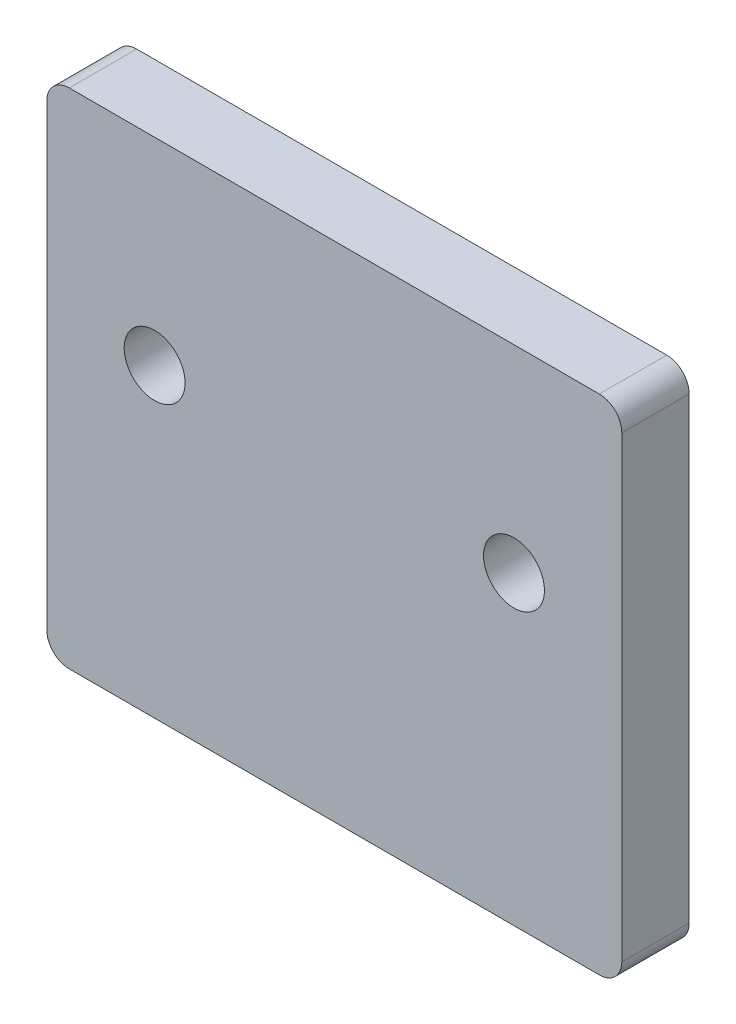
ISO-10303-21;
HEADER;
FILE_DESCRIPTION(('STEP AP214'),'2;1');
FILE_NAME('part.step','',(''),(''),'','','');
FILE_SCHEMA(('AUTOMOTIVE_DESIGN { 1 0 10303 214 1 1 1 1 }'));
ENDSEC;
DATA;
#1=APPLICATION_CONTEXT('core data for automotive mechanical design processes');
#2=APPLICATION_PROTOCOL_DEFINITION('international standard','automotive_design',2000,#1);
#3=PRODUCT_CONTEXT('',#1,'mechanical');
#4=PRODUCT('Part','Part','',(#3));
#5=PRODUCT_RELATED_PRODUCT_CATEGORY('part','',(#4));
#6=PRODUCT_DEFINITION_FORMATION('','',#4);
#7=PRODUCT_DEFINITION_CONTEXT('part definition',#1,'design');
#8=PRODUCT_DEFINITION('design','',#6,#7);
#9=PRODUCT_DEFINITION_SHAPE('','',#8);
#10=(LENGTH_UNIT() NAMED_UNIT(*) SI_UNIT(.MILLI.,.METRE.));
#11=(NAMED_UNIT(*) PLANE_ANGLE_UNIT() SI_UNIT($,.RADIAN.));
#12=(NAMED_UNIT(*) SI_UNIT($,.STERADIAN.) SOLID_ANGLE_UNIT());
#13=UNCERTAINTY_MEASURE_WITH_UNIT(LENGTH_MEASURE(1.E-05),#10,'distance_accuracy_value','');
#14=(GEOMETRIC_REPRESENTATION_CONTEXT(3) GLOBAL_UNCERTAINTY_ASSIGNED_CONTEXT((#13)) GLOBAL_UNIT_ASSIGNED_CONTEXT((#10,
#11,#12)) REPRESENTATION_CONTEXT('',''));
#15=CARTESIAN_POINT('',(0.,0.,0.));
#16=DIRECTION('',(0.,0.,1.));
#17=DIRECTION('',(1.,0.,0.));
#18=AXIS2_PLACEMENT_3D('',#15,#16,#17);
#19=CARTESIAN_POINT('',(-1.58750000000011,1.58749999999956,4.7625));
#20=DIRECTION('',(0.,0.,1.));
#21=DIRECTION('',(1.,0.,0.));
#22=AXIS2_PLACEMENT_3D('',#19,#20,#21);
#23=PLANE('',#22);
#24=CARTESIAN_POINT('',(-7.62000000000011,21.5899999999996,4.7625));
#25=DIRECTION('',(0.,0.,1.));
#26=DIRECTION('',(1.,0.,0.));
#27=AXIS2_PLACEMENT_3D('',#24,#25,#26);
#28=CIRCLE('',#27,2.15265);
#29=CARTESIAN_POINT('',(-9.77265000000011,21.5899999999996,4.7625));
#30=VERTEX_POINT('',#29);
#31=EDGE_CURVE('E134',#30,#30,#28,.T.);
#32=ORIENTED_EDGE('',*,*,#31,.F.);
#33=EDGE_LOOP('',(#32));
#34=FACE_BOUND('',#33,.T.);
#35=CARTESIAN_POINT('',(-1.58750000000011,1.58749999999956,4.7625));
#36=DIRECTION('',(0.,0.,1.));
#37=DIRECTION('',(1.,0.,0.));
#38=AXIS2_PLACEMENT_3D('',#35,#36,#37);
#39=CIRCLE('',#38,1.5875);
#40=CARTESIAN_POINT('',(-1.58750000000011,-4.43872369415566E-13,4.7625));
#41=VERTEX_POINT('',#40);
#42=CARTESIAN_POINT('',(-1.10588621593521E-13,1.58749999999956,4.7625));
#43=VERTEX_POINT('',#42);
#44=EDGE_CURVE('E145',#41,#43,#39,.T.);
#45=ORIENTED_EDGE('',*,*,#44,.T.);
#46=DIRECTION('',(0.,1.,0.));
#47=VECTOR('',#46,1.);
#48=CARTESIAN_POINT('',(-1.10588621593521E-13,1.58749999999956,4.7625));
#49=LINE('',#48,#47);
#50=CARTESIAN_POINT('',(-1.15142270717961E-13,33.9724999999996,4.7625));
#51=VERTEX_POINT('',#50);
#52=EDGE_CURVE('E93',#43,#51,#49,.T.);
#53=ORIENTED_EDGE('',*,*,#52,.T.);
#54=CARTESIAN_POINT('',(-1.58750000000011,33.9724999999996,4.7625));
#55=DIRECTION('',(0.,0.,1.));
#56=DIRECTION('',(1.,0.,0.));
#57=AXIS2_PLACEMENT_3D('',#54,#55,#56);
#58=CIRCLE('',#57,1.5875);
#59=CARTESIAN_POINT('',(-1.58750000000011,35.5599999999996,4.7625));
#60=VERTEX_POINT('',#59);
#61=EDGE_CURVE('E160',#51,#60,#58,.T.);
#62=ORIENTED_EDGE('',*,*,#61,.T.);
#63=DIRECTION('',(-1.,0.,0.));
#64=VECTOR('',#63,1.);
#65=CARTESIAN_POINT('',(-1.58750000000011,35.5599999999996,4.7625));
#66=LINE('',#65,#64);
#67=CARTESIAN_POINT('',(-39.0525000000001,35.5599999999995,4.7625));
#68=VERTEX_POINT('',#67);
#69=EDGE_CURVE('E173',#60,#68,#66,.T.);
#70=ORIENTED_EDGE('',*,*,#69,.T.);
#71=CARTESIAN_POINT('',(-39.0525000000001,33.9724999999995,4.7625));
#72=DIRECTION('',(0.,0.,1.));
#73=DIRECTION('',(1.,0.,0.));
#74=AXIS2_PLACEMENT_3D('',#71,#72,#73);
#75=CIRCLE('',#74,1.5875);
#76=CARTESIAN_POINT('',(-40.6400000000001,33.9724999999995,4.7625));
#77=VERTEX_POINT('',#76);
#78=EDGE_CURVE('E112',#68,#77,#75,.T.);
#79=ORIENTED_EDGE('',*,*,#78,.T.);
#80=DIRECTION('',(0.,-1.,0.));
#81=VECTOR('',#80,1.);
#82=CARTESIAN_POINT('',(-40.6400000000001,33.9724999999995,4.7625));
#83=LINE('',#82,#81);
#84=CARTESIAN_POINT('',(-40.6400000000001,1.58749999999955,4.7625));
#85=VERTEX_POINT('',#84);
#86=EDGE_CURVE('E106',#77,#85,#83,.T.);
#87=ORIENTED_EDGE('',*,*,#86,.T.);
#88=CARTESIAN_POINT('',(-39.0525000000001,1.58749999999955,4.7625));
#89=DIRECTION('',(0.,0.,1.));
#90=DIRECTION('',(1.,0.,0.));
#91=AXIS2_PLACEMENT_3D('',#88,#89,#90);
#92=CIRCLE('',#91,1.5875);
#93=CARTESIAN_POINT('',(-39.0525000000001,-4.47558656802016E-13,4.7625));
#94=VERTEX_POINT('',#93);
#95=EDGE_CURVE('E110',#85,#94,#92,.T.);
#96=ORIENTED_EDGE('',*,*,#95,.T.);
#97=DIRECTION('',(1.,0.,0.));
#98=VECTOR('',#97,1.);
#99=CARTESIAN_POINT('',(-39.0525000000001,-4.47558656802016E-13,4.7625));
#100=LINE('',#99,#98);
#101=EDGE_CURVE('E50',#94,#41,#100,.T.);
#102=ORIENTED_EDGE('',*,*,#101,.T.);
#103=EDGE_LOOP('',(#45,#53,#62,#70,#79,#87,#96,#102));
#104=FACE_BOUND('',#103,.T.);
#105=CARTESIAN_POINT('',(-33.0200000000001,21.5899999999996,4.7625));
#106=DIRECTION('',(0.,0.,1.));
#107=DIRECTION('',(1.,0.,0.));
#108=AXIS2_PLACEMENT_3D('',#105,#106,#107);
#109=CIRCLE('',#108,2.15265);
#110=CARTESIAN_POINT('',(-35.1726500000001,21.5899999999996,4.7625));
#111=VERTEX_POINT('',#110);
#112=EDGE_CURVE('E182',#111,#111,#109,.T.);
#113=ORIENTED_EDGE('',*,*,#112,.F.);
#114=EDGE_LOOP('',(#113));
#115=FACE_BOUND('',#114,.T.);
#116=ADVANCED_FACE('F33',(#34,#104,#115),#23,.T.);
#117=CARTESIAN_POINT('',(-1.58750000000011,1.58749999999956,0.));
#118=DIRECTION('',(0.,0.,1.));
#119=DIRECTION('',(1.,0.,0.));
#120=AXIS2_PLACEMENT_3D('',#117,#118,#119);
#121=PLANE('',#120);
#122=CARTESIAN_POINT('',(-1.58750000000011,1.58749999999956,0.));
#123=DIRECTION('',(0.,0.,1.));
#124=DIRECTION('',(1.,0.,0.));
#125=AXIS2_PLACEMENT_3D('',#122,#123,#124);
#126=CIRCLE('',#125,1.5875);
#127=CARTESIAN_POINT('',(-1.58750000000011,-4.43872369415566E-13,0.));
#128=VERTEX_POINT('',#127);
#129=CARTESIAN_POINT('',(-1.10588621593521E-13,1.58749999999956,0.));
#130=VERTEX_POINT('',#129);
#131=EDGE_CURVE('E130',#128,#130,#126,.T.);
#132=ORIENTED_EDGE('',*,*,#131,.F.);
#133=DIRECTION('',(1.,0.,0.));
#134=VECTOR('',#133,1.);
#135=CARTESIAN_POINT('',(-39.0525000000001,-4.47558656802016E-13,0.));
#136=LINE('',#135,#134);
#137=CARTESIAN_POINT('',(-39.0525000000001,-4.47558656802016E-13,0.));
#138=VERTEX_POINT('',#137);
#139=EDGE_CURVE('E85',#138,#128,#136,.T.);
#140=ORIENTED_EDGE('',*,*,#139,.F.);
#141=CARTESIAN_POINT('',(-39.0525000000001,1.58749999999955,0.));
#142=DIRECTION('',(0.,0.,1.));
#143=DIRECTION('',(1.,0.,0.));
#144=AXIS2_PLACEMENT_3D('',#141,#142,#143);
#145=CIRCLE('',#144,1.5875);
#146=CARTESIAN_POINT('',(-40.6400000000001,1.58749999999955,0.));
#147=VERTEX_POINT('',#146);
#148=EDGE_CURVE('E79',#147,#138,#145,.T.);
#149=ORIENTED_EDGE('',*,*,#148,.F.);
#150=DIRECTION('',(0.,-1.,0.));
#151=VECTOR('',#150,1.);
#152=CARTESIAN_POINT('',(-40.6400000000001,33.9724999999995,0.));
#153=LINE('',#152,#151);
#154=CARTESIAN_POINT('',(-40.6400000000001,33.9724999999995,0.));
#155=VERTEX_POINT('',#154);
#156=EDGE_CURVE('E120',#155,#147,#153,.T.);
#157=ORIENTED_EDGE('',*,*,#156,.F.);
#158=CARTESIAN_POINT('',(-39.0525000000001,33.9724999999995,0.));
#159=DIRECTION('',(0.,0.,1.));
#160=DIRECTION('',(1.,0.,0.));
#161=AXIS2_PLACEMENT_3D('',#158,#159,#160);
#162=CIRCLE('',#161,1.5875);
#163=CARTESIAN_POINT('',(-39.0525000000001,35.5599999999995,0.));
#164=VERTEX_POINT('',#163);
#165=EDGE_CURVE('E140',#164,#155,#162,.T.);
#166=ORIENTED_EDGE('',*,*,#165,.F.);
#167=DIRECTION('',(-1.,0.,0.));
#168=VECTOR('',#167,1.);
#169=CARTESIAN_POINT('',(-1.58750000000011,35.5599999999996,0.));
#170=LINE('',#169,#168);
#171=CARTESIAN_POINT('',(-1.58750000000011,35.5599999999996,0.));
#172=VERTEX_POINT('',#171);
#173=EDGE_CURVE('E138',#172,#164,#170,.T.);
#174=ORIENTED_EDGE('',*,*,#173,.F.);
#175=CARTESIAN_POINT('',(-1.58750000000011,33.9724999999996,0.));
#176=DIRECTION('',(0.,0.,1.));
#177=DIRECTION('',(1.,0.,0.));
#178=AXIS2_PLACEMENT_3D('',#175,#176,#177);
#179=CIRCLE('',#178,1.5875);
#180=CARTESIAN_POINT('',(-1.15142270717961E-13,33.9724999999996,0.));
#181=VERTEX_POINT('',#180);
#182=EDGE_CURVE('E136',#181,#172,#179,.T.);
#183=ORIENTED_EDGE('',*,*,#182,.F.);
#184=DIRECTION('',(0.,1.,0.));
#185=VECTOR('',#184,1.);
#186=CARTESIAN_POINT('',(-1.10588621593521E-13,1.58749999999956,0.));
#187=LINE('',#186,#185);
#188=EDGE_CURVE('E133',#130,#181,#187,.T.);
#189=ORIENTED_EDGE('',*,*,#188,.F.);
#190=EDGE_LOOP('',(#132,#140,#149,#157,#166,#174,#183,#189));
#191=FACE_BOUND('',#190,.T.);
#192=CARTESIAN_POINT('',(-7.62000000000011,21.5899999999996,0.));
#193=DIRECTION('',(0.,0.,1.));
#194=DIRECTION('',(1.,0.,0.));
#195=AXIS2_PLACEMENT_3D('',#192,#193,#194);
#196=CIRCLE('',#195,2.15265);
#197=CARTESIAN_POINT('',(-9.77265000000011,21.5899999999996,0.));
#198=VERTEX_POINT('',#197);
#199=EDGE_CURVE('E179',#198,#198,#196,.T.);
#200=ORIENTED_EDGE('',*,*,#199,.T.);
#201=EDGE_LOOP('',(#200));
#202=FACE_BOUND('',#201,.T.);
#203=CARTESIAN_POINT('',(-33.0200000000001,21.5899999999996,0.));
#204=DIRECTION('',(0.,0.,1.));
#205=DIRECTION('',(1.,0.,0.));
#206=AXIS2_PLACEMENT_3D('',#203,#204,#205);
#207=CIRCLE('',#206,2.15265);
#208=CARTESIAN_POINT('',(-35.1726500000001,21.5899999999996,0.));
#209=VERTEX_POINT('',#208);
#210=EDGE_CURVE('E185',#209,#209,#207,.T.);
#211=ORIENTED_EDGE('',*,*,#210,.T.);
#212=EDGE_LOOP('',(#211));
#213=FACE_BOUND('',#212,.T.);
#214=ADVANCED_FACE('F164',(#191,#202,#213),#121,.F.);
#215=CARTESIAN_POINT('',(-1.58750000000011,1.58749999999956,4.7625));
#216=DIRECTION('',(0.,0.,-1.));
#217=DIRECTION('',(-1.,0.,0.));
#218=AXIS2_PLACEMENT_3D('',#215,#216,#217);
#219=CYLINDRICAL_SURFACE('',#218,1.5875);
#220=ORIENTED_EDGE('',*,*,#131,.T.);
#221=DIRECTION('',(0.,0.,-1.));
#222=VECTOR('',#221,1.);
#223=CARTESIAN_POINT('',(-1.10588621593521E-13,1.58749999999956,4.7625));
#224=LINE('',#223,#222);
#225=EDGE_CURVE('E11',#43,#130,#224,.T.);
#226=ORIENTED_EDGE('',*,*,#225,.F.);
#227=ORIENTED_EDGE('',*,*,#44,.F.);
#228=DIRECTION('',(0.,0.,-1.));
#229=VECTOR('',#228,1.);
#230=CARTESIAN_POINT('',(-1.58750000000011,-4.43872369415566E-13,4.7625));
#231=LINE('',#230,#229);
#232=EDGE_CURVE('E126',#41,#128,#231,.T.);
#233=ORIENTED_EDGE('',*,*,#232,.T.);
#234=EDGE_LOOP('',(#220,#226,#227,#233));
#235=FACE_BOUND('',#234,.T.);
#236=ADVANCED_FACE('F35',(#235),#219,.T.);
#237=CARTESIAN_POINT('',(-1.10588621593521E-13,1.58749999999956,4.7625));
#238=DIRECTION('',(-1.,0.,0.));
#239=DIRECTION('',(0.,-1.,0.));
#240=AXIS2_PLACEMENT_3D('',#237,#238,#239);
#241=PLANE('',#240);
#242=ORIENTED_EDGE('',*,*,#188,.T.);
#243=DIRECTION('',(0.,0.,-1.));
#244=VECTOR('',#243,1.);
#245=CARTESIAN_POINT('',(-1.15142270717961E-13,33.9724999999996,4.7625));
#246=LINE('',#245,#244);
#247=EDGE_CURVE('E42',#51,#181,#246,.T.);
#248=ORIENTED_EDGE('',*,*,#247,.F.);
#249=ORIENTED_EDGE('',*,*,#52,.F.);
#250=ORIENTED_EDGE('',*,*,#225,.T.);
#251=EDGE_LOOP('',(#242,#248,#249,#250));
#252=FACE_BOUND('',#251,.T.);
#253=ADVANCED_FACE('F217',(#252),#241,.F.);
#254=CARTESIAN_POINT('',(-1.58750000000011,33.9724999999996,4.7625));
#255=DIRECTION('',(0.,0.,-1.));
#256=DIRECTION('',(-1.,0.,0.));
#257=AXIS2_PLACEMENT_3D('',#254,#255,#256);
#258=CYLINDRICAL_SURFACE('',#257,1.5875);
#259=ORIENTED_EDGE('',*,*,#182,.T.);
#260=DIRECTION('',(0.,0.,-1.));
#261=VECTOR('',#260,1.);
#262=CARTESIAN_POINT('',(-1.58750000000011,35.5599999999996,4.7625));
#263=LINE('',#262,#261);
#264=EDGE_CURVE('E152',#60,#172,#263,.T.);
#265=ORIENTED_EDGE('',*,*,#264,.F.);
#266=ORIENTED_EDGE('',*,*,#61,.F.);
#267=ORIENTED_EDGE('',*,*,#247,.T.);
#268=EDGE_LOOP('',(#259,#265,#266,#267));
#269=FACE_BOUND('',#268,.T.);
#270=ADVANCED_FACE('F158',(#269),#258,.T.);
#271=CARTESIAN_POINT('',(-1.58750000000011,35.5599999999996,4.7625));
#272=DIRECTION('',(0.,-1.,0.));
#273=DIRECTION('',(1.,0.,0.));
#274=AXIS2_PLACEMENT_3D('',#271,#272,#273);
#275=PLANE('',#274);
#276=ORIENTED_EDGE('',*,*,#173,.T.);
#277=DIRECTION('',(0.,0.,-1.));
#278=VECTOR('',#277,1.);
#279=CARTESIAN_POINT('',(-39.0525000000001,35.5599999999995,4.7625));
#280=LINE('',#279,#278);
#281=EDGE_CURVE('E149',#68,#164,#280,.T.);
#282=ORIENTED_EDGE('',*,*,#281,.F.);
#283=ORIENTED_EDGE('',*,*,#69,.F.);
#284=ORIENTED_EDGE('',*,*,#264,.T.);
#285=EDGE_LOOP('',(#276,#282,#283,#284));
#286=FACE_BOUND('',#285,.T.);
#287=ADVANCED_FACE('F169',(#286),#275,.F.);
#288=CARTESIAN_POINT('',(-39.0525000000001,33.9724999999995,4.7625));
#289=DIRECTION('',(0.,0.,-1.));
#290=DIRECTION('',(-1.,0.,0.));
#291=AXIS2_PLACEMENT_3D('',#288,#289,#290);
#292=CYLINDRICAL_SURFACE('',#291,1.5875);
#293=ORIENTED_EDGE('',*,*,#165,.T.);
#294=DIRECTION('',(0.,0.,-1.));
#295=VECTOR('',#294,1.);
#296=CARTESIAN_POINT('',(-40.6400000000001,33.9724999999995,4.7625));
#297=LINE('',#296,#295);
#298=EDGE_CURVE('E121',#77,#155,#297,.T.);
#299=ORIENTED_EDGE('',*,*,#298,.F.);
#300=ORIENTED_EDGE('',*,*,#78,.F.);
#301=ORIENTED_EDGE('',*,*,#281,.T.);
#302=EDGE_LOOP('',(#293,#299,#300,#301));
#303=FACE_BOUND('',#302,.T.);
#304=ADVANCED_FACE('F172',(#303),#292,.T.);
#305=CARTESIAN_POINT('',(-40.6400000000001,33.9724999999995,4.7625));
#306=DIRECTION('',(1.,0.,0.));
#307=DIRECTION('',(0.,1.,0.));
#308=AXIS2_PLACEMENT_3D('',#305,#306,#307);
#309=PLANE('',#308);
#310=ORIENTED_EDGE('',*,*,#156,.T.);
#311=DIRECTION('',(0.,0.,-1.));
#312=VECTOR('',#311,1.);
#313=CARTESIAN_POINT('',(-40.6400000000001,1.58749999999955,4.7625));
#314=LINE('',#313,#312);
#315=EDGE_CURVE('E117',#85,#147,#314,.T.);
#316=ORIENTED_EDGE('',*,*,#315,.F.);
#317=ORIENTED_EDGE('',*,*,#86,.F.);
#318=ORIENTED_EDGE('',*,*,#298,.T.);
#319=EDGE_LOOP('',(#310,#316,#317,#318));
#320=FACE_BOUND('',#319,.T.);
#321=ADVANCED_FACE('F118',(#320),#309,.F.);
#322=CARTESIAN_POINT('',(-39.0525000000001,1.58749999999955,4.7625));
#323=DIRECTION('',(0.,0.,-1.));
#324=DIRECTION('',(-1.,0.,0.));
#325=AXIS2_PLACEMENT_3D('',#322,#323,#324);
#326=CYLINDRICAL_SURFACE('',#325,1.5875);
#327=ORIENTED_EDGE('',*,*,#148,.T.);
#328=DIRECTION('',(0.,0.,-1.));
#329=VECTOR('',#328,1.);
#330=CARTESIAN_POINT('',(-39.0525000000001,-4.47558656802016E-13,4.7625));
#331=LINE('',#330,#329);
#332=EDGE_CURVE('E122',#94,#138,#331,.T.);
#333=ORIENTED_EDGE('',*,*,#332,.F.);
#334=ORIENTED_EDGE('',*,*,#95,.F.);
#335=ORIENTED_EDGE('',*,*,#315,.T.);
#336=EDGE_LOOP('',(#327,#333,#334,#335));
#337=FACE_BOUND('',#336,.T.);
#338=ADVANCED_FACE('F124',(#337),#326,.T.);
#339=CARTESIAN_POINT('',(-39.0525000000001,-4.47558656802016E-13,4.7625));
#340=DIRECTION('',(0.,1.,0.));
#341=DIRECTION('',(-1.,0.,0.));
#342=AXIS2_PLACEMENT_3D('',#339,#340,#341);
#343=PLANE('',#342);
#344=ORIENTED_EDGE('',*,*,#139,.T.);
#345=ORIENTED_EDGE('',*,*,#232,.F.);
#346=ORIENTED_EDGE('',*,*,#101,.F.);
#347=ORIENTED_EDGE('',*,*,#332,.T.);
#348=EDGE_LOOP('',(#344,#345,#346,#347));
#349=FACE_BOUND('',#348,.T.);
#350=ADVANCED_FACE('F205',(#349),#343,.F.);
#351=CARTESIAN_POINT('',(-7.62000000000011,21.5899999999996,4.7625));
#352=DIRECTION('',(0.,0.,-1.));
#353=DIRECTION('',(-1.,0.,0.));
#354=AXIS2_PLACEMENT_3D('',#351,#352,#353);
#355=CYLINDRICAL_SURFACE('',#354,2.15265);
#356=CARTESIAN_POINT('',(-9.77265000000011,21.5899999999996,4.7625));
#357=CARTESIAN_POINT('',(-9.77265000000011,21.5899999999996,4.712890625));
#358=CARTESIAN_POINT('',(-9.77265000000011,21.5899999999996,4.66328125));
#359=CARTESIAN_POINT('',(-9.77265000000011,21.5899999999996,4.5640625));
#360=CARTESIAN_POINT('',(-9.77265000000011,21.5899999999996,4.514453125));
#361=CARTESIAN_POINT('',(-9.77265000000011,21.5899999999996,4.415234375));
#362=CARTESIAN_POINT('',(-9.77265000000011,21.5899999999996,4.365625));
#363=CARTESIAN_POINT('',(-9.77265000000011,21.5899999999996,4.26640625));
#364=CARTESIAN_POINT('',(-9.77265000000011,21.5899999999996,4.216796875));
#365=CARTESIAN_POINT('',(-9.77265000000011,21.5899999999996,4.117578125));
#366=CARTESIAN_POINT('',(-9.77265000000011,21.5899999999996,4.06796875));
#367=CARTESIAN_POINT('',(-9.77265000000011,21.5899999999996,3.96875));
#368=CARTESIAN_POINT('',(-9.77265000000011,21.5899999999996,3.919140625));
#369=CARTESIAN_POINT('',(-9.77265000000011,21.5899999999996,3.819921875));
#370=CARTESIAN_POINT('',(-9.77265000000011,21.5899999999996,3.7703125));
#371=CARTESIAN_POINT('',(-9.77265000000011,21.5899999999996,3.67109375));
#372=CARTESIAN_POINT('',(-9.77265000000011,21.5899999999996,3.621484375));
#373=CARTESIAN_POINT('',(-9.77265000000011,21.5899999999996,3.522265625));
#374=CARTESIAN_POINT('',(-9.77265000000011,21.5899999999996,3.47265625));
#375=CARTESIAN_POINT('',(-9.77265000000011,21.5899999999996,3.3734375));
#376=CARTESIAN_POINT('',(-9.77265000000011,21.5899999999996,3.323828125));
#377=CARTESIAN_POINT('',(-9.77265000000011,21.5899999999996,3.224609375));
#378=CARTESIAN_POINT('',(-9.77265000000011,21.5899999999996,3.175));
#379=CARTESIAN_POINT('',(-9.77265000000011,21.5899999999996,3.07578125));
#380=CARTESIAN_POINT('',(-9.77265000000011,21.5899999999996,3.026171875));
#381=CARTESIAN_POINT('',(-9.77265000000011,21.5899999999996,2.926953125));
#382=CARTESIAN_POINT('',(-9.77265000000011,21.5899999999996,2.87734375));
#383=CARTESIAN_POINT('',(-9.77265000000011,21.5899999999996,2.778125));
#384=CARTESIAN_POINT('',(-9.77265000000011,21.5899999999996,2.728515625));
#385=CARTESIAN_POINT('',(-9.77265000000011,21.5899999999996,2.629296875));
#386=CARTESIAN_POINT('',(-9.77265000000011,21.5899999999996,2.5796875));
#387=CARTESIAN_POINT('',(-9.77265000000011,21.5899999999996,2.48046875));
#388=CARTESIAN_POINT('',(-9.77265000000011,21.5899999999996,2.430859375));
#389=CARTESIAN_POINT('',(-9.77265000000011,21.5899999999996,2.331640625));
#390=CARTESIAN_POINT('',(-9.77265000000011,21.5899999999996,2.28203125));
#391=CARTESIAN_POINT('',(-9.77265000000011,21.5899999999996,2.1828125));
#392=CARTESIAN_POINT('',(-9.77265000000011,21.5899999999996,2.133203125));
#393=CARTESIAN_POINT('',(-9.77265000000011,21.5899999999996,2.033984375));
#394=CARTESIAN_POINT('',(-9.77265000000011,21.5899999999996,1.984375));
#395=CARTESIAN_POINT('',(-9.77265000000011,21.5899999999996,1.88515625));
#396=CARTESIAN_POINT('',(-9.77265000000011,21.5899999999996,1.835546875));
#397=CARTESIAN_POINT('',(-9.77265000000011,21.5899999999996,1.736328125));
#398=CARTESIAN_POINT('',(-9.77265000000011,21.5899999999996,1.68671875));
#399=CARTESIAN_POINT('',(-9.77265000000011,21.5899999999996,1.5875));
#400=CARTESIAN_POINT('',(-9.77265000000011,21.5899999999996,1.537890625));
#401=CARTESIAN_POINT('',(-9.77265000000011,21.5899999999996,1.438671875));
#402=CARTESIAN_POINT('',(-9.77265000000011,21.5899999999996,1.3890625));
#403=CARTESIAN_POINT('',(-9.77265000000011,21.5899999999996,1.28984375));
#404=CARTESIAN_POINT('',(-9.77265000000011,21.5899999999996,1.240234375));
#405=CARTESIAN_POINT('',(-9.77265000000011,21.5899999999996,1.141015625));
#406=CARTESIAN_POINT('',(-9.77265000000011,21.5899999999996,1.09140625));
#407=CARTESIAN_POINT('',(-9.77265000000011,21.5899999999996,0.9921875));
#408=CARTESIAN_POINT('',(-9.77265000000011,21.5899999999996,0.942578125));
#409=CARTESIAN_POINT('',(-9.77265000000011,21.5899999999996,0.843359375));
#410=CARTESIAN_POINT('',(-9.77265000000011,21.5899999999996,0.79375));
#411=CARTESIAN_POINT('',(-9.77265000000011,21.5899999999996,0.69453125));
#412=CARTESIAN_POINT('',(-9.77265000000011,21.5899999999996,0.644921875));
#413=CARTESIAN_POINT('',(-9.77265000000011,21.5899999999996,0.545703125));
#414=CARTESIAN_POINT('',(-9.77265000000011,21.5899999999996,0.49609375));
#415=CARTESIAN_POINT('',(-9.77265000000011,21.5899999999996,0.396875));
#416=CARTESIAN_POINT('',(-9.77265000000011,21.5899999999996,0.347265625));
#417=CARTESIAN_POINT('',(-9.77265000000011,21.5899999999996,0.248046875));
#418=CARTESIAN_POINT('',(-9.77265000000011,21.5899999999996,0.1984375));
#419=CARTESIAN_POINT('',(-9.77265000000011,21.5899999999996,0.09921875));
#420=CARTESIAN_POINT('',(-9.77265000000011,21.5899999999996,0.049609375));
#421=CARTESIAN_POINT('',(-9.77265000000011,21.5899999999996,0.));
#422=B_SPLINE_CURVE_WITH_KNOTS('',3,(#356,#357,#358,#359,#360,#361,#362,#363,#364,#365,#366,
#367,#368,#369,#370,#371,#372,#373,#374,#375,#376,#377,#378,#379,#380,#381,#382,#383,#384,#385,
#386,#387,#388,#389,#390,#391,#392,#393,#394,#395,#396,#397,#398,#399,#400,#401,#402,#403,#404,
#405,#406,#407,#408,#409,#410,#411,#412,#413,#414,#415,#416,#417,#418,#419,#420,#421),
.UNSPECIFIED.,.F.,.F.,(4,2,2,2,2,2,2,2,2,2,2,2,2,2,2,2,2,2,2,2,2,2,2,2,2,2,2,2,2,2,2,2,4),(0.,
0.148828124999999,0.297656249999999,0.446484374999999,0.595312499999999,0.744140625,0.89296875,
1.041796875,1.190625,1.339453125,1.48828125,1.637109375,1.7859375,1.934765625,2.08359375,
2.232421875,2.38125,2.530078125,2.67890625,2.827734375,2.9765625,3.125390625,3.27421875,
3.423046875,3.571875,3.720703125,3.86953125,4.018359375,4.1671875,4.316015625,4.46484375,
4.613671875,4.7625),.UNSPECIFIED.);
#423=EDGE_CURVE('BSEAM202',#30,#198,#422,.T.);
#424=ORIENTED_EDGE('',*,*,#31,.T.);
#425=ORIENTED_EDGE('',*,*,#199,.F.);
#426=ORIENTED_EDGE('',*,*,#423,.T.);
#427=ORIENTED_EDGE('',*,*,#423,.F.);
#428=EDGE_LOOP('',(#424,#426,#425,#427));
#429=FACE_BOUND('',#428,.T.);
#430=ADVANCED_FACE('F202',(#429),#355,.F.);
#431=CARTESIAN_POINT('',(-33.0200000000001,21.5899999999996,4.7625));
#432=DIRECTION('',(0.,0.,-1.));
#433=DIRECTION('',(-1.,0.,0.));
#434=AXIS2_PLACEMENT_3D('',#431,#432,#433);
#435=CYLINDRICAL_SURFACE('',#434,2.15265);
#436=CARTESIAN_POINT('',(-35.1726500000001,21.5899999999996,4.7625));
#437=CARTESIAN_POINT('',(-35.1726500000001,21.5899999999996,4.712890625));
#438=CARTESIAN_POINT('',(-35.1726500000001,21.5899999999996,4.66328125));
#439=CARTESIAN_POINT('',(-35.1726500000001,21.5899999999996,4.5640625));
#440=CARTESIAN_POINT('',(-35.1726500000001,21.5899999999996,4.514453125));
#441=CARTESIAN_POINT('',(-35.1726500000001,21.5899999999996,4.415234375));
#442=CARTESIAN_POINT('',(-35.1726500000001,21.5899999999996,4.365625));
#443=CARTESIAN_POINT('',(-35.1726500000001,21.5899999999996,4.26640625));
#444=CARTESIAN_POINT('',(-35.1726500000001,21.5899999999996,4.216796875));
#445=CARTESIAN_POINT('',(-35.1726500000001,21.5899999999996,4.117578125));
#446=CARTESIAN_POINT('',(-35.1726500000001,21.5899999999996,4.06796875));
#447=CARTESIAN_POINT('',(-35.1726500000001,21.5899999999996,3.96875));
#448=CARTESIAN_POINT('',(-35.1726500000001,21.5899999999996,3.919140625));
#449=CARTESIAN_POINT('',(-35.1726500000001,21.5899999999996,3.819921875));
#450=CARTESIAN_POINT('',(-35.1726500000001,21.5899999999996,3.7703125));
#451=CARTESIAN_POINT('',(-35.1726500000001,21.5899999999996,3.67109375));
#452=CARTESIAN_POINT('',(-35.1726500000001,21.5899999999996,3.621484375));
#453=CARTESIAN_POINT('',(-35.1726500000001,21.5899999999996,3.522265625));
#454=CARTESIAN_POINT('',(-35.1726500000001,21.5899999999996,3.47265625));
#455=CARTESIAN_POINT('',(-35.1726500000001,21.5899999999996,3.3734375));
#456=CARTESIAN_POINT('',(-35.1726500000001,21.5899999999996,3.323828125));
#457=CARTESIAN_POINT('',(-35.1726500000001,21.5899999999996,3.224609375));
#458=CARTESIAN_POINT('',(-35.1726500000001,21.5899999999996,3.175));
#459=CARTESIAN_POINT('',(-35.1726500000001,21.5899999999996,3.07578125));
#460=CARTESIAN_POINT('',(-35.1726500000001,21.5899999999996,3.026171875));
#461=CARTESIAN_POINT('',(-35.1726500000001,21.5899999999996,2.926953125));
#462=CARTESIAN_POINT('',(-35.1726500000001,21.5899999999996,2.87734375));
#463=CARTESIAN_POINT('',(-35.1726500000001,21.5899999999996,2.778125));
#464=CARTESIAN_POINT('',(-35.1726500000001,21.5899999999996,2.728515625));
#465=CARTESIAN_POINT('',(-35.1726500000001,21.5899999999996,2.629296875));
#466=CARTESIAN_POINT('',(-35.1726500000001,21.5899999999996,2.5796875));
#467=CARTESIAN_POINT('',(-35.1726500000001,21.5899999999996,2.48046875));
#468=CARTESIAN_POINT('',(-35.1726500000001,21.5899999999996,2.430859375));
#469=CARTESIAN_POINT('',(-35.1726500000001,21.5899999999996,2.331640625));
#470=CARTESIAN_POINT('',(-35.1726500000001,21.5899999999996,2.28203125));
#471=CARTESIAN_POINT('',(-35.1726500000001,21.5899999999996,2.1828125));
#472=CARTESIAN_POINT('',(-35.1726500000001,21.5899999999996,2.133203125));
#473=CARTESIAN_POINT('',(-35.1726500000001,21.5899999999996,2.033984375));
#474=CARTESIAN_POINT('',(-35.1726500000001,21.5899999999996,1.984375));
#475=CARTESIAN_POINT('',(-35.1726500000001,21.5899999999996,1.88515625));
#476=CARTESIAN_POINT('',(-35.1726500000001,21.5899999999996,1.835546875));
#477=CARTESIAN_POINT('',(-35.1726500000001,21.5899999999996,1.736328125));
#478=CARTESIAN_POINT('',(-35.1726500000001,21.5899999999996,1.68671875));
#479=CARTESIAN_POINT('',(-35.1726500000001,21.5899999999996,1.5875));
#480=CARTESIAN_POINT('',(-35.1726500000001,21.5899999999996,1.537890625));
#481=CARTESIAN_POINT('',(-35.1726500000001,21.5899999999996,1.438671875));
#482=CARTESIAN_POINT('',(-35.1726500000001,21.5899999999996,1.3890625));
#483=CARTESIAN_POINT('',(-35.1726500000001,21.5899999999996,1.28984375));
#484=CARTESIAN_POINT('',(-35.1726500000001,21.5899999999996,1.240234375));
#485=CARTESIAN_POINT('',(-35.1726500000001,21.5899999999996,1.141015625));
#486=CARTESIAN_POINT('',(-35.1726500000001,21.5899999999996,1.09140625));
#487=CARTESIAN_POINT('',(-35.1726500000001,21.5899999999996,0.9921875));
#488=CARTESIAN_POINT('',(-35.1726500000001,21.5899999999996,0.942578125));
#489=CARTESIAN_POINT('',(-35.1726500000001,21.5899999999996,0.843359375));
#490=CARTESIAN_POINT('',(-35.1726500000001,21.5899999999996,0.79375));
#491=CARTESIAN_POINT('',(-35.1726500000001,21.5899999999996,0.69453125));
#492=CARTESIAN_POINT('',(-35.1726500000001,21.5899999999996,0.644921875));
#493=CARTESIAN_POINT('',(-35.1726500000001,21.5899999999996,0.545703125));
#494=CARTESIAN_POINT('',(-35.1726500000001,21.5899999999996,0.49609375));
#495=CARTESIAN_POINT('',(-35.1726500000001,21.5899999999996,0.396875));
#496=CARTESIAN_POINT('',(-35.1726500000001,21.5899999999996,0.347265625));
#497=CARTESIAN_POINT('',(-35.1726500000001,21.5899999999996,0.248046875));
#498=CARTESIAN_POINT('',(-35.1726500000001,21.5899999999996,0.1984375));
#499=CARTESIAN_POINT('',(-35.1726500000001,21.5899999999996,0.09921875));
#500=CARTESIAN_POINT('',(-35.1726500000001,21.5899999999996,0.049609375));
#501=CARTESIAN_POINT('',(-35.1726500000001,21.5899999999996,0.));
#502=B_SPLINE_CURVE_WITH_KNOTS('',3,(#436,#437,#438,#439,#440,#441,#442,#443,#444,#445,#446,
#447,#448,#449,#450,#451,#452,#453,#454,#455,#456,#457,#458,#459,#460,#461,#462,#463,#464,#465,
#466,#467,#468,#469,#470,#471,#472,#473,#474,#475,#476,#477,#478,#479,#480,#481,#482,#483,#484,
#485,#486,#487,#488,#489,#490,#491,#492,#493,#494,#495,#496,#497,#498,#499,#500,#501),
.UNSPECIFIED.,.F.,.F.,(4,2,2,2,2,2,2,2,2,2,2,2,2,2,2,2,2,2,2,2,2,2,2,2,2,2,2,2,2,2,2,2,4),(0.,
0.148828124999999,0.297656249999999,0.446484374999999,0.595312499999999,0.744140625,0.89296875,
1.041796875,1.190625,1.339453125,1.48828125,1.637109375,1.7859375,1.934765625,2.08359375,
2.232421875,2.38125,2.530078125,2.67890625,2.827734375,2.9765625,3.125390625,3.27421875,
3.423046875,3.571875,3.720703125,3.86953125,4.018359375,4.1671875,4.316015625,4.46484375,
4.613671875,4.7625),.UNSPECIFIED.);
#503=EDGE_CURVE('BSEAM191',#111,#209,#502,.T.);
#504=ORIENTED_EDGE('',*,*,#112,.T.);
#505=ORIENTED_EDGE('',*,*,#210,.F.);
#506=ORIENTED_EDGE('',*,*,#503,.T.);
#507=ORIENTED_EDGE('',*,*,#503,.F.);
#508=EDGE_LOOP('',(#504,#506,#505,#507));
#509=FACE_BOUND('',#508,.T.);
#510=ADVANCED_FACE('F191',(#509),#435,.F.);
#511=CLOSED_SHELL('',(#116,#214,#236,#253,#270,#287,#304,#321,#338,#350,#430,#510));
#512=MANIFOLD_SOLID_BREP('B2',#511);
#513=ADVANCED_BREP_SHAPE_REPRESENTATION('',(#18,#512),#14);
#514=SHAPE_DEFINITION_REPRESENTATION(#9,#513);
ENDSEC;
END-ISO-10303-21;
